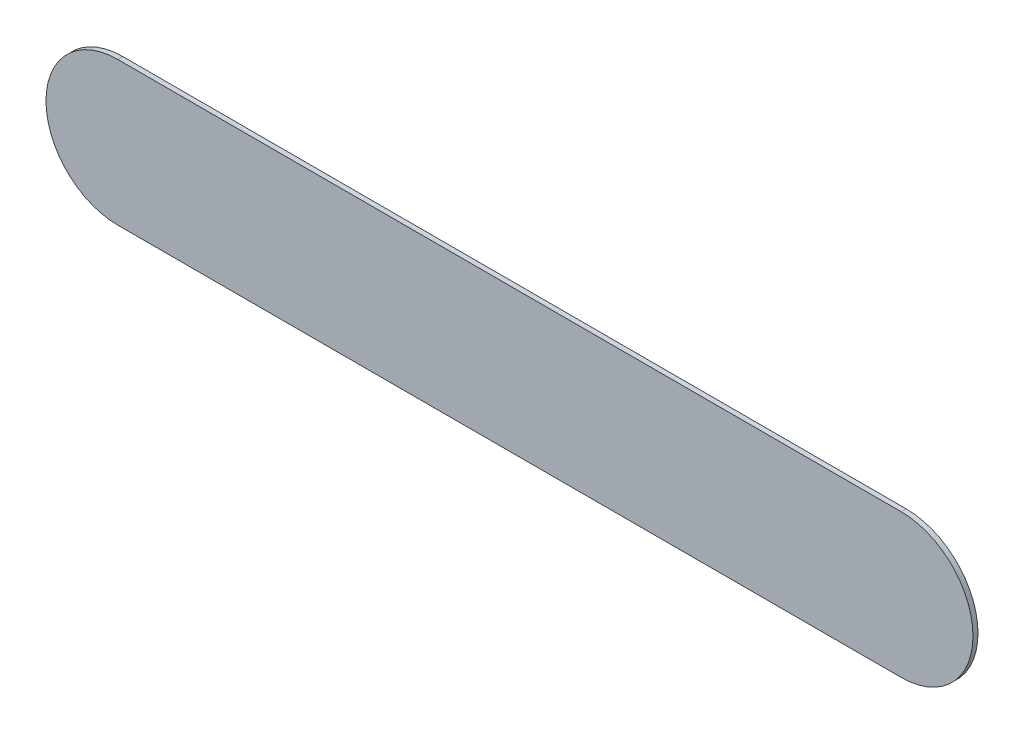
ISO-10303-21;
HEADER;
FILE_DESCRIPTION(('STEP AP214'),'2;1');
FILE_NAME('part.step','',(''),(''),'','','');
FILE_SCHEMA(('AUTOMOTIVE_DESIGN { 1 0 10303 214 1 1 1 1 }'));
ENDSEC;
DATA;
#1=APPLICATION_CONTEXT('core data for automotive mechanical design processes');
#2=APPLICATION_PROTOCOL_DEFINITION('international standard','automotive_design',2000,#1);
#3=PRODUCT_CONTEXT('',#1,'mechanical');
#4=PRODUCT('Part','Part','',(#3));
#5=PRODUCT_RELATED_PRODUCT_CATEGORY('part','',(#4));
#6=PRODUCT_DEFINITION_FORMATION('','',#4);
#7=PRODUCT_DEFINITION_CONTEXT('part definition',#1,'design');
#8=PRODUCT_DEFINITION('design','',#6,#7);
#9=PRODUCT_DEFINITION_SHAPE('','',#8);
#10=(LENGTH_UNIT() NAMED_UNIT(*) SI_UNIT(.MILLI.,.METRE.));
#11=(NAMED_UNIT(*) PLANE_ANGLE_UNIT() SI_UNIT($,.RADIAN.));
#12=(NAMED_UNIT(*) SI_UNIT($,.STERADIAN.) SOLID_ANGLE_UNIT());
#13=UNCERTAINTY_MEASURE_WITH_UNIT(LENGTH_MEASURE(1.E-05),#10,'distance_accuracy_value','');
#14=(GEOMETRIC_REPRESENTATION_CONTEXT(3) GLOBAL_UNCERTAINTY_ASSIGNED_CONTEXT((#13)) GLOBAL_UNIT_ASSIGNED_CONTEXT((#10,
#11,#12)) REPRESENTATION_CONTEXT('',''));
#15=CARTESIAN_POINT('',(0.,0.,0.));
#16=DIRECTION('',(0.,0.,1.));
#17=DIRECTION('',(1.,0.,0.));
#18=AXIS2_PLACEMENT_3D('',#15,#16,#17);
#19=CARTESIAN_POINT('',(86.57,-81.27,1.635));
#20=DIRECTION('',(0.,0.,1.));
#21=DIRECTION('',(1.,0.,0.));
#22=AXIS2_PLACEMENT_3D('',#19,#20,#21);
#23=PLANE('',#22);
#24=DIRECTION('',(1.,0.,0.));
#25=VECTOR('',#24,1.);
#26=CARTESIAN_POINT('',(86.57,-81.27,1.635));
#27=LINE('',#26,#25);
#28=CARTESIAN_POINT('',(86.57,-81.27,1.635));
#29=VERTEX_POINT('',#28);
#30=CARTESIAN_POINT('',(92.03,-81.27,1.635));
#31=VERTEX_POINT('',#30);
#32=EDGE_CURVE('E82',#29,#31,#27,.T.);
#33=ORIENTED_EDGE('',*,*,#32,.T.);
#34=CARTESIAN_POINT('',(92.03,-80.77,1.635));
#35=DIRECTION('',(0.,0.,1.));
#36=DIRECTION('',(0.,-1.,0.));
#37=AXIS2_PLACEMENT_3D('',#34,#35,#36);
#38=CIRCLE('',#37,0.5);
#39=CARTESIAN_POINT('',(92.03,-80.27,1.635));
#40=VERTEX_POINT('',#39);
#41=EDGE_CURVE('E80',#31,#40,#38,.T.);
#42=ORIENTED_EDGE('',*,*,#41,.T.);
#43=DIRECTION('',(-1.,0.,0.));
#44=VECTOR('',#43,1.);
#45=CARTESIAN_POINT('',(92.03,-80.27,1.635));
#46=LINE('',#45,#44);
#47=CARTESIAN_POINT('',(86.57,-80.27,1.635));
#48=VERTEX_POINT('',#47);
#49=EDGE_CURVE('E70',#40,#48,#46,.T.);
#50=ORIENTED_EDGE('',*,*,#49,.T.);
#51=CARTESIAN_POINT('',(86.57,-80.77,1.635));
#52=DIRECTION('',(0.,0.,1.));
#53=DIRECTION('',(0.,1.,0.));
#54=AXIS2_PLACEMENT_3D('',#51,#52,#53);
#55=CIRCLE('',#54,0.5);
#56=EDGE_CURVE('E11',#48,#29,#55,.T.);
#57=ORIENTED_EDGE('',*,*,#56,.T.);
#58=EDGE_LOOP('',(#33,#42,#50,#57));
#59=FACE_BOUND('',#58,.T.);
#60=ADVANCED_FACE('F17',(#59),#23,.T.);
#61=CARTESIAN_POINT('',(86.57,-81.27,1.6));
#62=DIRECTION('',(0.,0.,1.));
#63=DIRECTION('',(1.,0.,0.));
#64=AXIS2_PLACEMENT_3D('',#61,#62,#63);
#65=PLANE('',#64);
#66=CARTESIAN_POINT('',(86.57,-80.77,1.6));
#67=DIRECTION('',(0.,0.,1.));
#68=DIRECTION('',(0.,1.,0.));
#69=AXIS2_PLACEMENT_3D('',#66,#67,#68);
#70=CIRCLE('',#69,0.5);
#71=CARTESIAN_POINT('',(86.57,-80.27,1.6));
#72=VERTEX_POINT('',#71);
#73=CARTESIAN_POINT('',(86.57,-81.27,1.6));
#74=VERTEX_POINT('',#73);
#75=EDGE_CURVE('E27',#72,#74,#70,.T.);
#76=ORIENTED_EDGE('',*,*,#75,.F.);
#77=DIRECTION('',(-1.,0.,0.));
#78=VECTOR('',#77,1.);
#79=CARTESIAN_POINT('',(92.03,-80.27,1.6));
#80=LINE('',#79,#78);
#81=CARTESIAN_POINT('',(92.03,-80.27,1.6));
#82=VERTEX_POINT('',#81);
#83=EDGE_CURVE('E62',#82,#72,#80,.T.);
#84=ORIENTED_EDGE('',*,*,#83,.F.);
#85=CARTESIAN_POINT('',(92.03,-80.77,1.6));
#86=DIRECTION('',(0.,0.,1.));
#87=DIRECTION('',(0.,-1.,0.));
#88=AXIS2_PLACEMENT_3D('',#85,#86,#87);
#89=CIRCLE('',#88,0.5);
#90=CARTESIAN_POINT('',(92.03,-81.27,1.6));
#91=VERTEX_POINT('',#90);
#92=EDGE_CURVE('E89',#91,#82,#89,.T.);
#93=ORIENTED_EDGE('',*,*,#92,.F.);
#94=DIRECTION('',(1.,0.,0.));
#95=VECTOR('',#94,1.);
#96=CARTESIAN_POINT('',(86.57,-81.27,1.6));
#97=LINE('',#96,#95);
#98=EDGE_CURVE('E195',#74,#91,#97,.T.);
#99=ORIENTED_EDGE('',*,*,#98,.F.);
#100=EDGE_LOOP('',(#76,#84,#93,#99));
#101=FACE_BOUND('',#100,.T.);
#102=ADVANCED_FACE('F155',(#101),#65,.F.);
#103=CARTESIAN_POINT('',(86.57,-80.77,1.6));
#104=DIRECTION('',(0.,0.,-1.));
#105=DIRECTION('',(0.,1.,0.));
#106=AXIS2_PLACEMENT_3D('',#103,#104,#105);
#107=CYLINDRICAL_SURFACE('',#106,0.5);
#108=ORIENTED_EDGE('',*,*,#75,.T.);
#109=DIRECTION('',(0.,0.,1.));
#110=VECTOR('',#109,1.);
#111=CARTESIAN_POINT('',(86.57,-81.27,1.6));
#112=LINE('',#111,#110);
#113=EDGE_CURVE('E96',#74,#29,#112,.T.);
#114=ORIENTED_EDGE('',*,*,#113,.T.);
#115=ORIENTED_EDGE('',*,*,#56,.F.);
#116=DIRECTION('',(0.,0.,1.));
#117=VECTOR('',#116,1.);
#118=CARTESIAN_POINT('',(86.57,-80.27,1.6));
#119=LINE('',#118,#117);
#120=EDGE_CURVE('E20',#72,#48,#119,.T.);
#121=ORIENTED_EDGE('',*,*,#120,.F.);
#122=EDGE_LOOP('',(#108,#114,#115,#121));
#123=FACE_BOUND('',#122,.T.);
#124=ADVANCED_FACE('F146',(#123),#107,.T.);
#125=CARTESIAN_POINT('',(92.03,-80.27,1.6));
#126=DIRECTION('',(0.,-1.,0.));
#127=DIRECTION('',(0.,0.,-1.));
#128=AXIS2_PLACEMENT_3D('',#125,#126,#127);
#129=PLANE('',#128);
#130=ORIENTED_EDGE('',*,*,#83,.T.);
#131=ORIENTED_EDGE('',*,*,#120,.T.);
#132=ORIENTED_EDGE('',*,*,#49,.F.);
#133=DIRECTION('',(0.,0.,1.));
#134=VECTOR('',#133,1.);
#135=CARTESIAN_POINT('',(92.03,-80.27,1.6));
#136=LINE('',#135,#134);
#137=EDGE_CURVE('E74',#82,#40,#136,.T.);
#138=ORIENTED_EDGE('',*,*,#137,.F.);
#139=EDGE_LOOP('',(#130,#131,#132,#138));
#140=FACE_BOUND('',#139,.T.);
#141=ADVANCED_FACE('F72',(#140),#129,.F.);
#142=CARTESIAN_POINT('',(92.03,-80.77,1.6));
#143=DIRECTION('',(0.,0.,-1.));
#144=DIRECTION('',(0.,-1.,0.));
#145=AXIS2_PLACEMENT_3D('',#142,#143,#144);
#146=CYLINDRICAL_SURFACE('',#145,0.5);
#147=ORIENTED_EDGE('',*,*,#92,.T.);
#148=ORIENTED_EDGE('',*,*,#137,.T.);
#149=ORIENTED_EDGE('',*,*,#41,.F.);
#150=DIRECTION('',(0.,0.,1.));
#151=VECTOR('',#150,1.);
#152=CARTESIAN_POINT('',(92.03,-81.27,1.6));
#153=LINE('',#152,#151);
#154=EDGE_CURVE('E199',#91,#31,#153,.T.);
#155=ORIENTED_EDGE('',*,*,#154,.F.);
#156=EDGE_LOOP('',(#147,#148,#149,#155));
#157=FACE_BOUND('',#156,.T.);
#158=ADVANCED_FACE('F88',(#157),#146,.T.);
#159=CARTESIAN_POINT('',(86.57,-81.27,1.6));
#160=DIRECTION('',(0.,1.,0.));
#161=DIRECTION('',(1.,0.,0.));
#162=AXIS2_PLACEMENT_3D('',#159,#160,#161);
#163=PLANE('',#162);
#164=ORIENTED_EDGE('',*,*,#98,.T.);
#165=ORIENTED_EDGE('',*,*,#154,.T.);
#166=ORIENTED_EDGE('',*,*,#32,.F.);
#167=ORIENTED_EDGE('',*,*,#113,.F.);
#168=EDGE_LOOP('',(#164,#165,#166,#167));
#169=FACE_BOUND('',#168,.T.);
#170=ADVANCED_FACE('F123',(#169),#163,.F.);
#171=CLOSED_SHELL('',(#60,#102,#124,#141,#158,#170));
#172=MANIFOLD_SOLID_BREP('B1',#171);
#173=ADVANCED_BREP_SHAPE_REPRESENTATION('',(#18,#172),#14);
#174=SHAPE_DEFINITION_REPRESENTATION(#9,#173);
ENDSEC;
END-ISO-10303-21;
